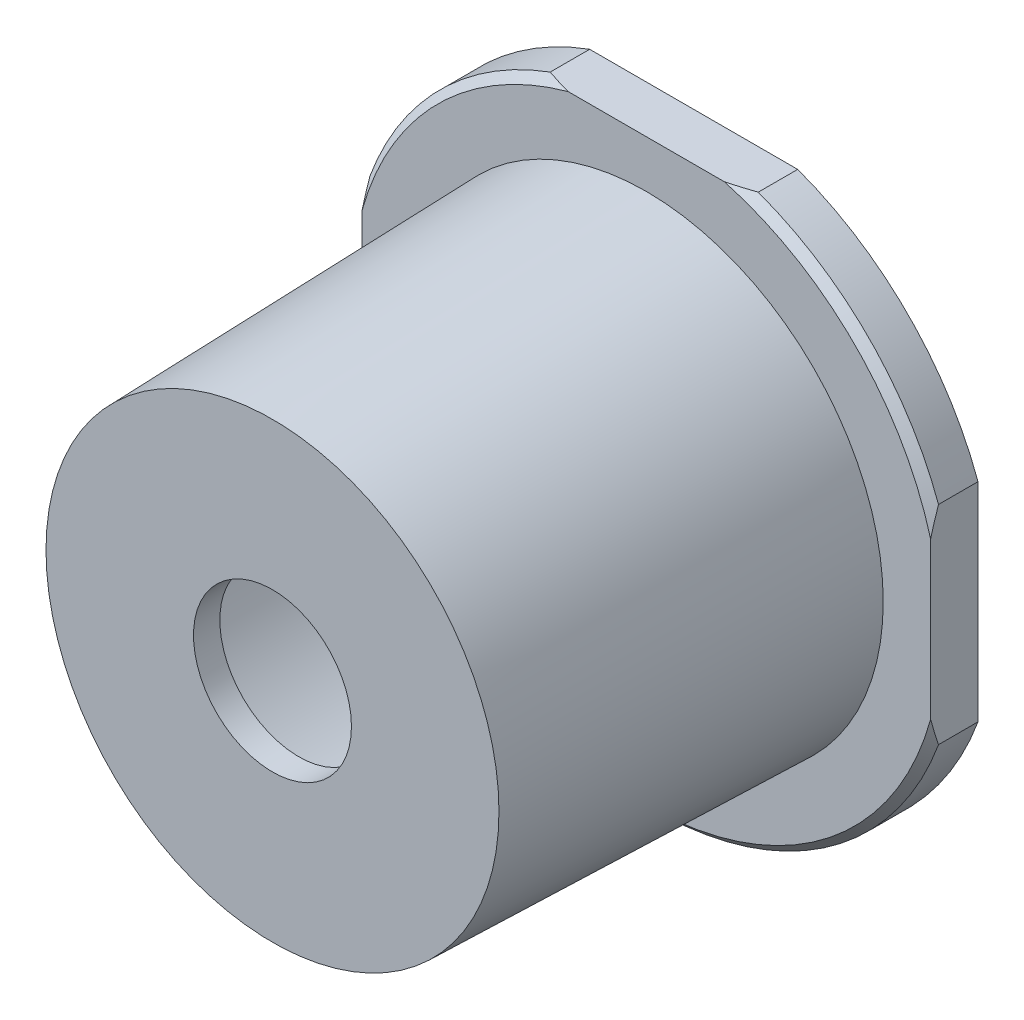
ISO-10303-21;
HEADER;
FILE_DESCRIPTION(('STEP AP214'),'2;1');
FILE_NAME('part.step','',(''),(''),'','','');
FILE_SCHEMA(('AUTOMOTIVE_DESIGN { 1 0 10303 214 1 1 1 1 }'));
ENDSEC;
DATA;
#1=APPLICATION_CONTEXT('core data for automotive mechanical design processes');
#2=APPLICATION_PROTOCOL_DEFINITION('international standard','automotive_design',2000,#1);
#3=PRODUCT_CONTEXT('',#1,'mechanical');
#4=PRODUCT('Part','Part','',(#3));
#5=PRODUCT_RELATED_PRODUCT_CATEGORY('part','',(#4));
#6=PRODUCT_DEFINITION_FORMATION('','',#4);
#7=PRODUCT_DEFINITION_CONTEXT('part definition',#1,'design');
#8=PRODUCT_DEFINITION('design','',#6,#7);
#9=PRODUCT_DEFINITION_SHAPE('','',#8);
#10=(LENGTH_UNIT() NAMED_UNIT(*) SI_UNIT(.MILLI.,.METRE.));
#11=(NAMED_UNIT(*) PLANE_ANGLE_UNIT() SI_UNIT($,.RADIAN.));
#12=(NAMED_UNIT(*) SI_UNIT($,.STERADIAN.) SOLID_ANGLE_UNIT());
#13=UNCERTAINTY_MEASURE_WITH_UNIT(LENGTH_MEASURE(1.E-05),#10,'distance_accuracy_value','');
#14=(GEOMETRIC_REPRESENTATION_CONTEXT(3) GLOBAL_UNCERTAINTY_ASSIGNED_CONTEXT((#13)) GLOBAL_UNIT_ASSIGNED_CONTEXT((#10,
#11,#12)) REPRESENTATION_CONTEXT('',''));
#15=CARTESIAN_POINT('',(0.,0.,0.));
#16=DIRECTION('',(0.,0.,1.));
#17=DIRECTION('',(1.,0.,0.));
#18=AXIS2_PLACEMENT_3D('',#15,#16,#17);
#19=CARTESIAN_POINT('',(0.,0.,18.));
#20=DIRECTION('',(0.,0.,1.));
#21=DIRECTION('',(1.,0.,0.));
#22=AXIS2_PLACEMENT_3D('',#19,#20,#21);
#23=PLANE('',#22);
#24=DIRECTION('',(0.,1.,0.));
#25=VECTOR('',#24,1.);
#26=CARTESIAN_POINT('',(108.,39.5094925302769,18.));
#27=LINE('',#26,#25);
#28=CARTESIAN_POINT('',(108.,-29.6647939483827,18.));
#29=VERTEX_POINT('',#28);
#30=CARTESIAN_POINT('',(108.,29.6647939483828,18.));
#31=VERTEX_POINT('',#30);
#32=EDGE_CURVE('E527',#29,#31,#27,.T.);
#33=ORIENTED_EDGE('',*,*,#32,.T.);
#34=CARTESIAN_POINT('',(0.,0.,18.));
#35=DIRECTION('',(0.,0.,1.));
#36=DIRECTION('',(1.,0.,0.));
#37=AXIS2_PLACEMENT_3D('',#34,#35,#36);
#38=CIRCLE('',#37,112.);
#39=CARTESIAN_POINT('',(29.6647939483828,108.,18.));
#40=VERTEX_POINT('',#39);
#41=EDGE_CURVE('E590',#31,#40,#38,.T.);
#42=ORIENTED_EDGE('',*,*,#41,.T.);
#43=DIRECTION('',(-1.,0.,0.));
#44=VECTOR('',#43,1.);
#45=CARTESIAN_POINT('',(-39.5094925302768,108.,18.));
#46=LINE('',#45,#44);
#47=CARTESIAN_POINT('',(-29.6647939483827,108.,18.));
#48=VERTEX_POINT('',#47);
#49=EDGE_CURVE('E523',#40,#48,#46,.T.);
#50=ORIENTED_EDGE('',*,*,#49,.T.);
#51=CARTESIAN_POINT('',(0.,0.,18.));
#52=DIRECTION('',(0.,0.,1.));
#53=DIRECTION('',(1.,0.,0.));
#54=AXIS2_PLACEMENT_3D('',#51,#52,#53);
#55=CIRCLE('',#54,112.);
#56=CARTESIAN_POINT('',(-108.,29.6647939483827,18.));
#57=VERTEX_POINT('',#56);
#58=EDGE_CURVE('E612',#48,#57,#55,.T.);
#59=ORIENTED_EDGE('',*,*,#58,.T.);
#60=DIRECTION('',(0.,-1.,0.));
#61=VECTOR('',#60,1.);
#62=CARTESIAN_POINT('',(-108.,39.5094925302768,18.));
#63=LINE('',#62,#61);
#64=CARTESIAN_POINT('',(-108.,-29.6647939483827,18.));
#65=VERTEX_POINT('',#64);
#66=EDGE_CURVE('E525',#57,#65,#63,.T.);
#67=ORIENTED_EDGE('',*,*,#66,.T.);
#68=CARTESIAN_POINT('',(0.,0.,18.));
#69=DIRECTION('',(0.,0.,1.));
#70=DIRECTION('',(1.,0.,0.));
#71=AXIS2_PLACEMENT_3D('',#68,#69,#70);
#72=CIRCLE('',#71,112.);
#73=EDGE_CURVE('E542',#65,#29,#72,.T.);
#74=ORIENTED_EDGE('',*,*,#73,.T.);
#75=EDGE_LOOP('',(#33,#42,#50,#59,#67,#74));
#76=FACE_BOUND('',#75,.T.);
#77=CARTESIAN_POINT('',(0.,0.,18.));
#78=DIRECTION('',(0.,0.,1.));
#79=DIRECTION('',(1.,0.,0.));
#80=AXIS2_PLACEMENT_3D('',#77,#78,#79);
#81=CIRCLE('',#80,90.);
#82=CARTESIAN_POINT('',(90.,0.,18.));
#83=VERTEX_POINT('',#82);
#84=EDGE_CURVE('E499',#83,#83,#81,.T.);
#85=ORIENTED_EDGE('',*,*,#84,.F.);
#86=EDGE_LOOP('',(#85));
#87=FACE_BOUND('',#86,.T.);
#88=ADVANCED_FACE('F349',(#76,#87),#23,.T.);
#89=CARTESIAN_POINT('',(0.,0.,18.));
#90=DIRECTION('',(0.,0.,-1.));
#91=DIRECTION('',(-1.,0.,0.));
#92=AXIS2_PLACEMENT_3D('',#89,#90,#91);
#93=CYLINDRICAL_SURFACE('',#92,115.);
#94=DIRECTION('',(0.,0.,-1.));
#95=VECTOR('',#94,1.);
#96=CARTESIAN_POINT('',(39.5094925302768,108.,18.));
#97=LINE('',#96,#95);
#98=CARTESIAN_POINT('',(39.5094925302768,108.,15.));
#99=VERTEX_POINT('',#98);
#100=CARTESIAN_POINT('',(39.5094925302768,108.,0.));
#101=VERTEX_POINT('',#100);
#102=EDGE_CURVE('E540',#99,#101,#97,.T.);
#103=ORIENTED_EDGE('',*,*,#102,.F.);
#104=CARTESIAN_POINT('',(0.,0.,15.));
#105=DIRECTION('',(0.,0.,1.));
#106=DIRECTION('',(1.,0.,0.));
#107=AXIS2_PLACEMENT_3D('',#104,#105,#106);
#108=CIRCLE('',#107,115.);
#109=CARTESIAN_POINT('',(108.,39.5094925302769,15.));
#110=VERTEX_POINT('',#109);
#111=EDGE_CURVE('E358',#99,#110,#108,.F.);
#112=ORIENTED_EDGE('',*,*,#111,.T.);
#113=DIRECTION('',(0.,0.,-1.));
#114=VECTOR('',#113,1.);
#115=CARTESIAN_POINT('',(108.,39.5094925302769,18.));
#116=LINE('',#115,#114);
#117=CARTESIAN_POINT('',(108.,39.5094925302769,0.));
#118=VERTEX_POINT('',#117);
#119=EDGE_CURVE('E530',#110,#118,#116,.T.);
#120=ORIENTED_EDGE('',*,*,#119,.T.);
#121=CARTESIAN_POINT('',(0.,0.,0.));
#122=DIRECTION('',(0.,0.,1.));
#123=DIRECTION('',(1.,0.,0.));
#124=AXIS2_PLACEMENT_3D('',#121,#122,#123);
#125=CIRCLE('',#124,115.);
#126=EDGE_CURVE('E505',#118,#101,#125,.T.);
#127=ORIENTED_EDGE('',*,*,#126,.T.);
#128=EDGE_LOOP('',(#103,#112,#120,#127));
#129=FACE_BOUND('',#128,.T.);
#130=ADVANCED_FACE('F351',(#129),#93,.T.);
#131=CARTESIAN_POINT('',(-39.5094925302768,108.,18.));
#132=DIRECTION('',(0.,-1.,0.));
#133=DIRECTION('',(0.,0.,-1.));
#134=AXIS2_PLACEMENT_3D('',#131,#132,#133);
#135=PLANE('',#134);
#136=ORIENTED_EDGE('',*,*,#49,.F.);
#137=CARTESIAN_POINT('',(29.6647939483828,108.,18.));
#138=CARTESIAN_POINT('',(30.4941711796091,108.,17.7803300114298));
#139=CARTESIAN_POINT('',(31.3214164818125,108.,17.5526537263399));
#140=CARTESIAN_POINT('',(32.9712497524552,108.,17.0819830716863));
#141=CARTESIAN_POINT('',(33.7938391433217,108.,16.838993690178));
#142=CARTESIAN_POINT('',(35.4344929751852,108.,16.3382517901058));
#143=CARTESIAN_POINT('',(36.252557481415,108.,16.0804994849826));
#144=CARTESIAN_POINT('',(37.8843588688999,108.,15.5507584209631));
#145=CARTESIAN_POINT('',(38.6980942612752,108.,15.2787650740456));
#146=CARTESIAN_POINT('',(39.5094925302768,108.,15.));
#147=B_SPLINE_CURVE_WITH_KNOTS('',3,(#137,#138,#139,#140,#141,#142,#143,#144,#145,#146),
.UNSPECIFIED.,.F.,.F.,(4,2,2,2,4),(0.,2.57386992833235,5.14690574048575,7.71990436134134,
10.2937370851217),.UNSPECIFIED.);
#148=EDGE_CURVE('E585',#40,#99,#147,.T.);
#149=ORIENTED_EDGE('',*,*,#148,.T.);
#150=ORIENTED_EDGE('',*,*,#102,.T.);
#151=DIRECTION('',(-1.,0.,0.));
#152=VECTOR('',#151,1.);
#153=CARTESIAN_POINT('',(-39.5094925302768,108.,0.));
#154=LINE('',#153,#152);
#155=CARTESIAN_POINT('',(-39.5094925302768,108.,0.));
#156=VERTEX_POINT('',#155);
#157=EDGE_CURVE('E508',#101,#156,#154,.T.);
#158=ORIENTED_EDGE('',*,*,#157,.T.);
#159=DIRECTION('',(0.,0.,-1.));
#160=VECTOR('',#159,1.);
#161=CARTESIAN_POINT('',(-39.5094925302768,108.,18.));
#162=LINE('',#161,#160);
#163=CARTESIAN_POINT('',(-39.5094925302768,108.,15.));
#164=VERTEX_POINT('',#163);
#165=EDGE_CURVE('E538',#164,#156,#162,.T.);
#166=ORIENTED_EDGE('',*,*,#165,.F.);
#167=CARTESIAN_POINT('',(-39.5094925302768,108.,15.));
#168=CARTESIAN_POINT('',(-38.6980942612752,108.,15.2787650740456));
#169=CARTESIAN_POINT('',(-37.8843588688999,108.,15.5507584209631));
#170=CARTESIAN_POINT('',(-36.2525574814149,108.,16.0804994849826));
#171=CARTESIAN_POINT('',(-35.4344929751851,108.,16.3382517901058));
#172=CARTESIAN_POINT('',(-33.7938391433217,108.,16.838993690178));
#173=CARTESIAN_POINT('',(-32.9712497524552,108.,17.0819830716863));
#174=CARTESIAN_POINT('',(-31.3214164818124,108.,17.5526537263399));
#175=CARTESIAN_POINT('',(-30.4941711796091,108.,17.7803300114298));
#176=CARTESIAN_POINT('',(-29.6647939483827,108.,18.));
#177=B_SPLINE_CURVE_WITH_KNOTS('',3,(#167,#168,#169,#170,#171,#172,#173,#174,#175,#176),
.UNSPECIFIED.,.F.,.F.,(4,2,2,2,4),(0.,2.57383272378042,5.14683134463602,7.71986715678944,
10.2937370851218),.UNSPECIFIED.);
#178=EDGE_CURVE('E599',#164,#48,#177,.T.);
#179=ORIENTED_EDGE('',*,*,#178,.T.);
#180=EDGE_LOOP('',(#136,#149,#150,#158,#166,#179));
#181=FACE_BOUND('',#180,.T.);
#182=ADVANCED_FACE('F592',(#181),#135,.F.);
#183=CARTESIAN_POINT('',(0.,0.,18.));
#184=DIRECTION('',(0.,0.,-1.));
#185=DIRECTION('',(-1.,0.,0.));
#186=AXIS2_PLACEMENT_3D('',#183,#184,#185);
#187=CYLINDRICAL_SURFACE('',#186,115.);
#188=DIRECTION('',(0.,0.,-1.));
#189=VECTOR('',#188,1.);
#190=CARTESIAN_POINT('',(-108.,39.5094925302768,18.));
#191=LINE('',#190,#189);
#192=CARTESIAN_POINT('',(-108.,39.5094925302768,15.));
#193=VERTEX_POINT('',#192);
#194=CARTESIAN_POINT('',(-108.,39.5094925302768,0.));
#195=VERTEX_POINT('',#194);
#196=EDGE_CURVE('E536',#193,#195,#191,.T.);
#197=ORIENTED_EDGE('',*,*,#196,.F.);
#198=CARTESIAN_POINT('',(0.,0.,15.));
#199=DIRECTION('',(0.,0.,1.));
#200=DIRECTION('',(1.,0.,0.));
#201=AXIS2_PLACEMENT_3D('',#198,#199,#200);
#202=CIRCLE('',#201,115.);
#203=EDGE_CURVE('E605',#193,#164,#202,.F.);
#204=ORIENTED_EDGE('',*,*,#203,.T.);
#205=ORIENTED_EDGE('',*,*,#165,.T.);
#206=CARTESIAN_POINT('',(0.,0.,0.));
#207=DIRECTION('',(0.,0.,1.));
#208=DIRECTION('',(1.,0.,0.));
#209=AXIS2_PLACEMENT_3D('',#206,#207,#208);
#210=CIRCLE('',#209,115.);
#211=EDGE_CURVE('E511',#156,#195,#210,.T.);
#212=ORIENTED_EDGE('',*,*,#211,.T.);
#213=EDGE_LOOP('',(#197,#204,#205,#212));
#214=FACE_BOUND('',#213,.T.);
#215=ADVANCED_FACE('F596',(#214),#187,.T.);
#216=CARTESIAN_POINT('',(-108.,39.5094925302768,18.));
#217=DIRECTION('',(1.,0.,0.));
#218=DIRECTION('',(0.,0.,-1.));
#219=AXIS2_PLACEMENT_3D('',#216,#217,#218);
#220=PLANE('',#219);
#221=ORIENTED_EDGE('',*,*,#66,.F.);
#222=CARTESIAN_POINT('',(-108.,29.6647939483827,18.));
#223=CARTESIAN_POINT('',(-108.,30.494171179609,17.7803300114298));
#224=CARTESIAN_POINT('',(-108.,31.3214164818124,17.5526537263399));
#225=CARTESIAN_POINT('',(-108.,32.9712497524551,17.0819830716863));
#226=CARTESIAN_POINT('',(-108.,33.7938391433216,16.838993690178));
#227=CARTESIAN_POINT('',(-108.,35.4344929751851,16.3382517901058));
#228=CARTESIAN_POINT('',(-108.,36.2525574814149,16.0804994849825));
#229=CARTESIAN_POINT('',(-108.,37.8843588688999,15.5507584209631));
#230=CARTESIAN_POINT('',(-108.,38.6980942612752,15.2787650740456));
#231=CARTESIAN_POINT('',(-108.,39.5094925302768,15.));
#232=B_SPLINE_CURVE_WITH_KNOTS('',3,(#222,#223,#224,#225,#226,#227,#228,#229,#230,#231),
.UNSPECIFIED.,.F.,.F.,(4,2,2,2,4),(0.,2.57386992833237,5.1469057404858,7.71990436134141,
10.2937370851218),.UNSPECIFIED.);
#233=EDGE_CURVE('E607',#57,#193,#232,.T.);
#234=ORIENTED_EDGE('',*,*,#233,.T.);
#235=ORIENTED_EDGE('',*,*,#196,.T.);
#236=DIRECTION('',(0.,-1.,0.));
#237=VECTOR('',#236,1.);
#238=CARTESIAN_POINT('',(-108.,39.5094925302768,0.));
#239=LINE('',#238,#237);
#240=CARTESIAN_POINT('',(-108.,-39.5094925302768,0.));
#241=VERTEX_POINT('',#240);
#242=EDGE_CURVE('E514',#195,#241,#239,.T.);
#243=ORIENTED_EDGE('',*,*,#242,.T.);
#244=DIRECTION('',(0.,0.,-1.));
#245=VECTOR('',#244,1.);
#246=CARTESIAN_POINT('',(-108.,-39.5094925302768,18.));
#247=LINE('',#246,#245);
#248=CARTESIAN_POINT('',(-108.,-39.5094925302768,15.));
#249=VERTEX_POINT('',#248);
#250=EDGE_CURVE('E534',#249,#241,#247,.T.);
#251=ORIENTED_EDGE('',*,*,#250,.F.);
#252=CARTESIAN_POINT('',(-108.,-39.5094925302768,15.));
#253=CARTESIAN_POINT('',(-108.,-38.6980942612752,15.2787650740456));
#254=CARTESIAN_POINT('',(-108.,-37.8843588688999,15.5507584209631));
#255=CARTESIAN_POINT('',(-108.,-36.2525574814149,16.0804994849826));
#256=CARTESIAN_POINT('',(-108.,-35.4344929751851,16.3382517901058));
#257=CARTESIAN_POINT('',(-108.,-33.7938391433216,16.838993690178));
#258=CARTESIAN_POINT('',(-108.,-32.9712497524551,17.0819830716863));
#259=CARTESIAN_POINT('',(-108.,-31.3214164818124,17.5526537263399));
#260=CARTESIAN_POINT('',(-108.,-30.494171179609,17.7803300114298));
#261=CARTESIAN_POINT('',(-108.,-29.6647939483827,18.));
#262=B_SPLINE_CURVE_WITH_KNOTS('',3,(#252,#253,#254,#255,#256,#257,#258,#259,#260,#261),
.UNSPECIFIED.,.F.,.F.,(4,2,2,2,4),(0.,2.57383272378042,5.14683134463603,7.71986715678945,
10.2937370851218),.UNSPECIFIED.);
#263=EDGE_CURVE('E618',#249,#65,#262,.T.);
#264=ORIENTED_EDGE('',*,*,#263,.T.);
#265=EDGE_LOOP('',(#221,#234,#235,#243,#251,#264));
#266=FACE_BOUND('',#265,.T.);
#267=ADVANCED_FACE('F613',(#266),#220,.F.);
#268=CARTESIAN_POINT('',(0.,0.,18.));
#269=DIRECTION('',(0.,0.,-1.));
#270=DIRECTION('',(-1.,0.,0.));
#271=AXIS2_PLACEMENT_3D('',#268,#269,#270);
#272=CYLINDRICAL_SURFACE('',#271,115.);
#273=DIRECTION('',(0.,0.,-1.));
#274=VECTOR('',#273,1.);
#275=CARTESIAN_POINT('',(108.,-39.5094925302769,18.));
#276=LINE('',#275,#274);
#277=CARTESIAN_POINT('',(108.,-39.5094925302769,15.));
#278=VERTEX_POINT('',#277);
#279=CARTESIAN_POINT('',(108.,-39.5094925302769,0.));
#280=VERTEX_POINT('',#279);
#281=EDGE_CURVE('E532',#278,#280,#276,.T.);
#282=ORIENTED_EDGE('',*,*,#281,.F.);
#283=CARTESIAN_POINT('',(0.,0.,15.));
#284=DIRECTION('',(0.,0.,1.));
#285=DIRECTION('',(1.,0.,0.));
#286=AXIS2_PLACEMENT_3D('',#283,#284,#285);
#287=CIRCLE('',#286,115.);
#288=EDGE_CURVE('E552',#278,#249,#287,.F.);
#289=ORIENTED_EDGE('',*,*,#288,.T.);
#290=ORIENTED_EDGE('',*,*,#250,.T.);
#291=CARTESIAN_POINT('',(0.,0.,0.));
#292=DIRECTION('',(0.,0.,1.));
#293=DIRECTION('',(1.,0.,0.));
#294=AXIS2_PLACEMENT_3D('',#291,#292,#293);
#295=CIRCLE('',#294,115.);
#296=EDGE_CURVE('E517',#241,#280,#295,.T.);
#297=ORIENTED_EDGE('',*,*,#296,.T.);
#298=EDGE_LOOP('',(#282,#289,#290,#297));
#299=FACE_BOUND('',#298,.T.);
#300=ADVANCED_FACE('F563',(#299),#272,.T.);
#301=CARTESIAN_POINT('',(108.,39.5094925302769,18.));
#302=DIRECTION('',(-1.,0.,0.));
#303=DIRECTION('',(0.,0.,1.));
#304=AXIS2_PLACEMENT_3D('',#301,#302,#303);
#305=PLANE('',#304);
#306=ORIENTED_EDGE('',*,*,#119,.F.);
#307=CARTESIAN_POINT('',(108.,39.5094925302769,15.));
#308=CARTESIAN_POINT('',(108.,38.6980942612753,15.2787650740456));
#309=CARTESIAN_POINT('',(108.,37.8843588689,15.5507584209631));
#310=CARTESIAN_POINT('',(108.,36.252557481415,16.0804994849825));
#311=CARTESIAN_POINT('',(108.,35.4344929751852,16.3382517901058));
#312=CARTESIAN_POINT('',(108.,33.7938391433218,16.838993690178));
#313=CARTESIAN_POINT('',(108.,32.9712497524552,17.0819830716863));
#314=CARTESIAN_POINT('',(108.,31.3214164818125,17.5526537263399));
#315=CARTESIAN_POINT('',(108.,30.4941711796091,17.7803300114298));
#316=CARTESIAN_POINT('',(108.,29.6647939483828,18.));
#317=B_SPLINE_CURVE_WITH_KNOTS('',3,(#307,#308,#309,#310,#311,#312,#313,#314,#315,#316),
.UNSPECIFIED.,.F.,.F.,(4,2,2,2,4),(0.,2.57383272378041,5.14683134463599,7.7198671567894,
10.2937370851217),.UNSPECIFIED.);
#318=EDGE_CURVE('E11',#110,#31,#317,.T.);
#319=ORIENTED_EDGE('',*,*,#318,.T.);
#320=ORIENTED_EDGE('',*,*,#32,.F.);
#321=CARTESIAN_POINT('',(108.,-29.6647939483828,18.));
#322=CARTESIAN_POINT('',(108.,-30.4941711796091,17.7803300114298));
#323=CARTESIAN_POINT('',(108.,-31.3214164818125,17.5526537263399));
#324=CARTESIAN_POINT('',(108.,-32.9712497524552,17.0819830716863));
#325=CARTESIAN_POINT('',(108.,-33.7938391433217,16.838993690178));
#326=CARTESIAN_POINT('',(108.,-35.4344929751852,16.3382517901058));
#327=CARTESIAN_POINT('',(108.,-36.252557481415,16.0804994849826));
#328=CARTESIAN_POINT('',(108.,-37.8843588688999,15.5507584209631));
#329=CARTESIAN_POINT('',(108.,-38.6980942612753,15.2787650740456));
#330=CARTESIAN_POINT('',(108.,-39.5094925302769,15.));
#331=B_SPLINE_CURVE_WITH_KNOTS('',3,(#321,#322,#323,#324,#325,#326,#327,#328,#329,#330),
.UNSPECIFIED.,.F.,.F.,(4,2,2,2,4),(0.,2.57386992833236,5.14690574048577,7.71990436134138,
10.2937370851218),.UNSPECIFIED.);
#332=EDGE_CURVE('E545',#29,#278,#331,.T.);
#333=ORIENTED_EDGE('',*,*,#332,.T.);
#334=ORIENTED_EDGE('',*,*,#281,.T.);
#335=DIRECTION('',(0.,1.,0.));
#336=VECTOR('',#335,1.);
#337=CARTESIAN_POINT('',(108.,39.5094925302769,0.));
#338=LINE('',#337,#336);
#339=EDGE_CURVE('E520',#280,#118,#338,.T.);
#340=ORIENTED_EDGE('',*,*,#339,.T.);
#341=EDGE_LOOP('',(#306,#319,#320,#333,#334,#340));
#342=FACE_BOUND('',#341,.T.);
#343=ADVANCED_FACE('F558',(#342),#305,.F.);
#344=CARTESIAN_POINT('',(0.,0.,0.));
#345=DIRECTION('',(0.,0.,1.));
#346=DIRECTION('',(1.,0.,0.));
#347=AXIS2_PLACEMENT_3D('',#344,#345,#346);
#348=PLANE('',#347);
#349=DIRECTION('',(0.,1.,0.));
#350=VECTOR('',#349,1.);
#351=CARTESIAN_POINT('',(98.,39.5094925302769,0.));
#352=LINE('',#351,#350);
#353=CARTESIAN_POINT('',(98.,-37.6961536499416,0.));
#354=VERTEX_POINT('',#353);
#355=CARTESIAN_POINT('',(98.,37.6961536499416,0.));
#356=VERTEX_POINT('',#355);
#357=EDGE_CURVE('E480',#354,#356,#352,.T.);
#358=ORIENTED_EDGE('',*,*,#357,.T.);
#359=CARTESIAN_POINT('',(0.,0.,0.));
#360=DIRECTION('',(0.,0.,1.));
#361=DIRECTION('',(1.,0.,0.));
#362=AXIS2_PLACEMENT_3D('',#359,#360,#361);
#363=CIRCLE('',#362,105.);
#364=CARTESIAN_POINT('',(37.6961536499415,98.,0.));
#365=VERTEX_POINT('',#364);
#366=EDGE_CURVE('E462',#356,#365,#363,.T.);
#367=ORIENTED_EDGE('',*,*,#366,.T.);
#368=DIRECTION('',(-1.,0.,0.));
#369=VECTOR('',#368,1.);
#370=CARTESIAN_POINT('',(-39.5094925302768,98.,0.));
#371=LINE('',#370,#369);
#372=CARTESIAN_POINT('',(-37.6961536499415,98.,0.));
#373=VERTEX_POINT('',#372);
#374=EDGE_CURVE('E472',#365,#373,#371,.T.);
#375=ORIENTED_EDGE('',*,*,#374,.T.);
#376=CARTESIAN_POINT('',(0.,0.,0.));
#377=DIRECTION('',(0.,0.,1.));
#378=DIRECTION('',(1.,0.,0.));
#379=AXIS2_PLACEMENT_3D('',#376,#377,#378);
#380=CIRCLE('',#379,105.);
#381=CARTESIAN_POINT('',(-98.,37.6961536499415,0.));
#382=VERTEX_POINT('',#381);
#383=EDGE_CURVE('E365',#373,#382,#380,.T.);
#384=ORIENTED_EDGE('',*,*,#383,.T.);
#385=DIRECTION('',(0.,-1.,0.));
#386=VECTOR('',#385,1.);
#387=CARTESIAN_POINT('',(-98.,39.5094925302768,0.));
#388=LINE('',#387,#386);
#389=CARTESIAN_POINT('',(-98.,-37.6961536499415,0.));
#390=VERTEX_POINT('',#389);
#391=EDGE_CURVE('E491',#382,#390,#388,.T.);
#392=ORIENTED_EDGE('',*,*,#391,.T.);
#393=CARTESIAN_POINT('',(0.,0.,0.));
#394=DIRECTION('',(0.,0.,1.));
#395=DIRECTION('',(1.,0.,0.));
#396=AXIS2_PLACEMENT_3D('',#393,#394,#395);
#397=CIRCLE('',#396,105.);
#398=EDGE_CURVE('E489',#390,#354,#397,.T.);
#399=ORIENTED_EDGE('',*,*,#398,.T.);
#400=EDGE_LOOP('',(#358,#367,#375,#384,#392,#399));
#401=FACE_BOUND('',#400,.T.);
#402=ORIENTED_EDGE('',*,*,#126,.F.);
#403=ORIENTED_EDGE('',*,*,#339,.F.);
#404=ORIENTED_EDGE('',*,*,#296,.F.);
#405=ORIENTED_EDGE('',*,*,#242,.F.);
#406=ORIENTED_EDGE('',*,*,#211,.F.);
#407=ORIENTED_EDGE('',*,*,#157,.F.);
#408=EDGE_LOOP('',(#402,#403,#404,#405,#406,#407));
#409=FACE_BOUND('',#408,.T.);
#410=ADVANCED_FACE('F476',(#401,#409),#348,.F.);
#411=CARTESIAN_POINT('',(0.,0.,18.));
#412=DIRECTION('',(0.,0.,-1.));
#413=DIRECTION('',(1.,0.,0.));
#414=AXIS2_PLACEMENT_3D('',#411,#412,#413);
#415=CONICAL_SURFACE('',#414,90.,0.0279252680319093);
#416=CARTESIAN_POINT('',(0.,0.,160.));
#417=DIRECTION('',(0.,0.,1.));
#418=DIRECTION('',(1.,0.,0.));
#419=AXIS2_PLACEMENT_3D('',#416,#417,#418);
#420=CIRCLE('',#419,86.0335808540846);
#421=CARTESIAN_POINT('',(86.0335808540846,0.,160.));
#422=VERTEX_POINT('',#421);
#423=EDGE_CURVE('E502',#422,#422,#420,.T.);
#424=ORIENTED_EDGE('',*,*,#423,.F.);
#425=EDGE_LOOP('',(#424));
#426=FACE_BOUND('',#425,.T.);
#427=ORIENTED_EDGE('',*,*,#84,.T.);
#428=EDGE_LOOP('',(#427));
#429=FACE_BOUND('',#428,.T.);
#430=ADVANCED_FACE('F692',(#426,#429),#415,.T.);
#431=CARTESIAN_POINT('',(0.,0.,160.));
#432=DIRECTION('',(0.,0.,1.));
#433=DIRECTION('',(1.,0.,0.));
#434=AXIS2_PLACEMENT_3D('',#431,#432,#433);
#435=PLANE('',#434);
#436=CARTESIAN_POINT('',(0.,0.,160.));
#437=DIRECTION('',(0.,0.,1.));
#438=DIRECTION('',(1.,0.,0.));
#439=AXIS2_PLACEMENT_3D('',#436,#437,#438);
#440=CIRCLE('',#439,30.);
#441=CARTESIAN_POINT('',(30.,0.,160.));
#442=VERTEX_POINT('',#441);
#443=EDGE_CURVE('E753',#442,#442,#440,.T.);
#444=ORIENTED_EDGE('',*,*,#443,.F.);
#445=EDGE_LOOP('',(#444));
#446=FACE_BOUND('',#445,.T.);
#447=ORIENTED_EDGE('',*,*,#423,.T.);
#448=EDGE_LOOP('',(#447));
#449=FACE_BOUND('',#448,.T.);
#450=ADVANCED_FACE('F683',(#446,#449),#435,.T.);
#451=CARTESIAN_POINT('',(0.,0.,18.));
#452=DIRECTION('',(0.,0.,-1.));
#453=DIRECTION('',(-1.,0.,0.));
#454=AXIS2_PLACEMENT_3D('',#451,#452,#453);
#455=CONICAL_SURFACE('',#454,112.,0.785398163397447);
#456=ORIENTED_EDGE('',*,*,#263,.F.);
#457=ORIENTED_EDGE('',*,*,#288,.F.);
#458=ORIENTED_EDGE('',*,*,#332,.F.);
#459=ORIENTED_EDGE('',*,*,#73,.F.);
#460=EDGE_LOOP('',(#456,#457,#458,#459));
#461=FACE_BOUND('',#460,.T.);
#462=ADVANCED_FACE('F554',(#461),#455,.T.);
#463=CARTESIAN_POINT('',(0.,0.,18.));
#464=DIRECTION('',(0.,0.,-1.));
#465=DIRECTION('',(-1.,0.,0.));
#466=AXIS2_PLACEMENT_3D('',#463,#464,#465);
#467=CONICAL_SURFACE('',#466,112.,0.785398163397443);
#468=ORIENTED_EDGE('',*,*,#178,.F.);
#469=ORIENTED_EDGE('',*,*,#203,.F.);
#470=ORIENTED_EDGE('',*,*,#233,.F.);
#471=ORIENTED_EDGE('',*,*,#58,.F.);
#472=EDGE_LOOP('',(#468,#469,#470,#471));
#473=FACE_BOUND('',#472,.T.);
#474=ADVANCED_FACE('F579',(#473),#467,.T.);
#475=CARTESIAN_POINT('',(0.,0.,18.));
#476=DIRECTION('',(0.,0.,-1.));
#477=DIRECTION('',(-1.,0.,0.));
#478=AXIS2_PLACEMENT_3D('',#475,#476,#477);
#479=CONICAL_SURFACE('',#478,112.,0.785398163397443);
#480=ORIENTED_EDGE('',*,*,#318,.F.);
#481=ORIENTED_EDGE('',*,*,#111,.F.);
#482=ORIENTED_EDGE('',*,*,#148,.F.);
#483=ORIENTED_EDGE('',*,*,#41,.F.);
#484=EDGE_LOOP('',(#480,#481,#482,#483));
#485=FACE_BOUND('',#484,.T.);
#486=ADVANCED_FACE('F574',(#485),#479,.T.);
#487=CARTESIAN_POINT('',(0.,0.,8.));
#488=DIRECTION('',(0.,0.,1.));
#489=DIRECTION('',(1.,0.,0.));
#490=AXIS2_PLACEMENT_3D('',#487,#488,#489);
#491=PLANE('',#490);
#492=CARTESIAN_POINT('',(0.,0.,8.));
#493=DIRECTION('',(0.,0.,1.));
#494=DIRECTION('',(1.,0.,0.));
#495=AXIS2_PLACEMENT_3D('',#492,#493,#494);
#496=CIRCLE('',#495,105.);
#497=CARTESIAN_POINT('',(37.6961536499415,98.,8.));
#498=VERTEX_POINT('',#497);
#499=CARTESIAN_POINT('',(98.,37.6961536499416,8.));
#500=VERTEX_POINT('',#499);
#501=EDGE_CURVE('E464',#498,#500,#496,.F.);
#502=ORIENTED_EDGE('',*,*,#501,.T.);
#503=DIRECTION('',(0.,1.,0.));
#504=VECTOR('',#503,1.);
#505=CARTESIAN_POINT('',(98.,39.5094925302769,8.));
#506=LINE('',#505,#504);
#507=CARTESIAN_POINT('',(98.,-37.6961536499416,8.));
#508=VERTEX_POINT('',#507);
#509=EDGE_CURVE('E763',#508,#500,#506,.T.);
#510=ORIENTED_EDGE('',*,*,#509,.F.);
#511=CARTESIAN_POINT('',(0.,0.,8.));
#512=DIRECTION('',(0.,0.,1.));
#513=DIRECTION('',(1.,0.,0.));
#514=AXIS2_PLACEMENT_3D('',#511,#512,#513);
#515=CIRCLE('',#514,105.);
#516=CARTESIAN_POINT('',(-98.,-37.6961536499415,8.));
#517=VERTEX_POINT('',#516);
#518=EDGE_CURVE('E496',#508,#517,#515,.F.);
#519=ORIENTED_EDGE('',*,*,#518,.T.);
#520=DIRECTION('',(0.,-1.,0.));
#521=VECTOR('',#520,1.);
#522=CARTESIAN_POINT('',(-98.,39.5094925302768,8.));
#523=LINE('',#522,#521);
#524=CARTESIAN_POINT('',(-98.,37.6961536499415,8.));
#525=VERTEX_POINT('',#524);
#526=EDGE_CURVE('E755',#525,#517,#523,.T.);
#527=ORIENTED_EDGE('',*,*,#526,.F.);
#528=CARTESIAN_POINT('',(0.,0.,8.));
#529=DIRECTION('',(0.,0.,1.));
#530=DIRECTION('',(1.,0.,0.));
#531=AXIS2_PLACEMENT_3D('',#528,#529,#530);
#532=CIRCLE('',#531,105.);
#533=CARTESIAN_POINT('',(-37.6961536499415,98.,8.));
#534=VERTEX_POINT('',#533);
#535=EDGE_CURVE('E468',#534,#525,#532,.T.);
#536=ORIENTED_EDGE('',*,*,#535,.F.);
#537=DIRECTION('',(-1.,0.,0.));
#538=VECTOR('',#537,1.);
#539=CARTESIAN_POINT('',(-39.5094925302768,98.,8.));
#540=LINE('',#539,#538);
#541=EDGE_CURVE('E488',#498,#534,#540,.T.);
#542=ORIENTED_EDGE('',*,*,#541,.F.);
#543=EDGE_LOOP('',(#502,#510,#519,#527,#536,#542));
#544=FACE_BOUND('',#543,.T.);
#545=CARTESIAN_POINT('',(0.,0.,8.));
#546=DIRECTION('',(0.,0.,1.));
#547=DIRECTION('',(1.,0.,0.));
#548=AXIS2_PLACEMENT_3D('',#545,#546,#547);
#549=CIRCLE('',#548,80.2754249216737);
#550=CARTESIAN_POINT('',(80.2754249216737,0.,8.));
#551=VERTEX_POINT('',#550);
#552=EDGE_CURVE('E484',#551,#551,#549,.T.);
#553=ORIENTED_EDGE('',*,*,#552,.T.);
#554=EDGE_LOOP('',(#553));
#555=FACE_BOUND('',#554,.T.);
#556=ADVANCED_FACE('F578',(#544,#555),#491,.F.);
#557=CARTESIAN_POINT('',(0.,0.,18.));
#558=DIRECTION('',(0.,0.,-1.));
#559=DIRECTION('',(-1.,0.,0.));
#560=AXIS2_PLACEMENT_3D('',#557,#558,#559);
#561=CYLINDRICAL_SURFACE('',#560,105.);
#562=DIRECTION('',(0.,0.,-1.));
#563=VECTOR('',#562,1.);
#564=CARTESIAN_POINT('',(37.6961536499415,98.,10.8578643762691));
#565=LINE('',#564,#563);
#566=EDGE_CURVE('E457',#498,#365,#565,.T.);
#567=ORIENTED_EDGE('',*,*,#566,.T.);
#568=ORIENTED_EDGE('',*,*,#366,.F.);
#569=DIRECTION('',(0.,0.,-1.));
#570=VECTOR('',#569,1.);
#571=CARTESIAN_POINT('',(98.,37.6961536499416,10.8578643762691));
#572=LINE('',#571,#570);
#573=EDGE_CURVE('E760',#500,#356,#572,.T.);
#574=ORIENTED_EDGE('',*,*,#573,.F.);
#575=ORIENTED_EDGE('',*,*,#501,.F.);
#576=EDGE_LOOP('',(#567,#568,#574,#575));
#577=FACE_BOUND('',#576,.T.);
#578=ADVANCED_FACE('F459',(#577),#561,.F.);
#579=CARTESIAN_POINT('',(-39.5094925302768,98.,18.));
#580=DIRECTION('',(0.,-1.,0.));
#581=DIRECTION('',(0.,0.,-1.));
#582=AXIS2_PLACEMENT_3D('',#579,#580,#581);
#583=PLANE('',#582);
#584=DIRECTION('',(0.,0.,-1.));
#585=VECTOR('',#584,1.);
#586=CARTESIAN_POINT('',(-37.6961536499415,98.,10.8578643762691));
#587=LINE('',#586,#585);
#588=EDGE_CURVE('E469',#534,#373,#587,.T.);
#589=ORIENTED_EDGE('',*,*,#588,.T.);
#590=ORIENTED_EDGE('',*,*,#374,.F.);
#591=ORIENTED_EDGE('',*,*,#566,.F.);
#592=ORIENTED_EDGE('',*,*,#541,.T.);
#593=EDGE_LOOP('',(#589,#590,#591,#592));
#594=FACE_BOUND('',#593,.T.);
#595=ADVANCED_FACE('F473',(#594),#583,.T.);
#596=CARTESIAN_POINT('',(0.,0.,18.));
#597=DIRECTION('',(0.,0.,-1.));
#598=DIRECTION('',(-1.,0.,0.));
#599=AXIS2_PLACEMENT_3D('',#596,#597,#598);
#600=CYLINDRICAL_SURFACE('',#599,105.);
#601=ORIENTED_EDGE('',*,*,#535,.T.);
#602=DIRECTION('',(0.,0.,-1.));
#603=VECTOR('',#602,1.);
#604=CARTESIAN_POINT('',(-98.,37.6961536499415,10.8578643762691));
#605=LINE('',#604,#603);
#606=EDGE_CURVE('E759',#525,#382,#605,.T.);
#607=ORIENTED_EDGE('',*,*,#606,.T.);
#608=ORIENTED_EDGE('',*,*,#383,.F.);
#609=ORIENTED_EDGE('',*,*,#588,.F.);
#610=EDGE_LOOP('',(#601,#607,#608,#609));
#611=FACE_BOUND('',#610,.T.);
#612=ADVANCED_FACE('F727',(#611),#600,.F.);
#613=CARTESIAN_POINT('',(-98.,39.5094925302768,18.));
#614=DIRECTION('',(1.,0.,0.));
#615=DIRECTION('',(0.,0.,-1.));
#616=AXIS2_PLACEMENT_3D('',#613,#614,#615);
#617=PLANE('',#616);
#618=DIRECTION('',(0.,0.,-1.));
#619=VECTOR('',#618,1.);
#620=CARTESIAN_POINT('',(-98.,-37.6961536499415,10.8578643762691));
#621=LINE('',#620,#619);
#622=EDGE_CURVE('E765',#517,#390,#621,.T.);
#623=ORIENTED_EDGE('',*,*,#622,.T.);
#624=ORIENTED_EDGE('',*,*,#391,.F.);
#625=ORIENTED_EDGE('',*,*,#606,.F.);
#626=ORIENTED_EDGE('',*,*,#526,.T.);
#627=EDGE_LOOP('',(#623,#624,#625,#626));
#628=FACE_BOUND('',#627,.T.);
#629=ADVANCED_FACE('F732',(#628),#617,.T.);
#630=CARTESIAN_POINT('',(0.,0.,18.));
#631=DIRECTION('',(0.,0.,-1.));
#632=DIRECTION('',(-1.,0.,0.));
#633=AXIS2_PLACEMENT_3D('',#630,#631,#632);
#634=CYLINDRICAL_SURFACE('',#633,105.);
#635=DIRECTION('',(0.,0.,-1.));
#636=VECTOR('',#635,1.);
#637=CARTESIAN_POINT('',(98.,-37.6961536499416,10.8578643762691));
#638=LINE('',#637,#636);
#639=EDGE_CURVE('E762',#508,#354,#638,.T.);
#640=ORIENTED_EDGE('',*,*,#639,.T.);
#641=ORIENTED_EDGE('',*,*,#398,.F.);
#642=ORIENTED_EDGE('',*,*,#622,.F.);
#643=ORIENTED_EDGE('',*,*,#518,.F.);
#644=EDGE_LOOP('',(#640,#641,#642,#643));
#645=FACE_BOUND('',#644,.T.);
#646=ADVANCED_FACE('F730',(#645),#634,.F.);
#647=CARTESIAN_POINT('',(98.,39.5094925302769,18.));
#648=DIRECTION('',(-1.,0.,0.));
#649=DIRECTION('',(0.,0.,1.));
#650=AXIS2_PLACEMENT_3D('',#647,#648,#649);
#651=PLANE('',#650);
#652=ORIENTED_EDGE('',*,*,#573,.T.);
#653=ORIENTED_EDGE('',*,*,#357,.F.);
#654=ORIENTED_EDGE('',*,*,#639,.F.);
#655=ORIENTED_EDGE('',*,*,#509,.T.);
#656=EDGE_LOOP('',(#652,#653,#654,#655));
#657=FACE_BOUND('',#656,.T.);
#658=ADVANCED_FACE('F728',(#657),#651,.T.);
#659=CARTESIAN_POINT('',(0.,0.,17.7207836127643));
#660=DIRECTION('',(0.,0.,-1.));
#661=DIRECTION('',(1.,0.,0.));
#662=AXIS2_PLACEMENT_3D('',#659,#660,#661);
#663=CONICAL_SURFACE('',#662,80.0038988495965,0.0279252680319093);
#664=CARTESIAN_POINT('',(0.,0.,150.));
#665=DIRECTION('',(0.,0.,1.));
#666=DIRECTION('',(1.,0.,0.));
#667=AXIS2_PLACEMENT_3D('',#664,#665,#666);
#668=CIRCLE('',#667,76.3090057757583);
#669=CARTESIAN_POINT('',(76.3090057757583,0.,150.));
#670=VERTEX_POINT('',#669);
#671=EDGE_CURVE('E481',#670,#670,#668,.T.);
#672=ORIENTED_EDGE('',*,*,#671,.T.);
#673=EDGE_LOOP('',(#672));
#674=FACE_BOUND('',#673,.T.);
#675=ORIENTED_EDGE('',*,*,#552,.F.);
#676=EDGE_LOOP('',(#675));
#677=FACE_BOUND('',#676,.T.);
#678=ADVANCED_FACE('F705',(#674,#677),#663,.F.);
#679=CARTESIAN_POINT('',(0.,0.,150.));
#680=DIRECTION('',(0.,0.,1.));
#681=DIRECTION('',(1.,0.,0.));
#682=AXIS2_PLACEMENT_3D('',#679,#680,#681);
#683=PLANE('',#682);
#684=CARTESIAN_POINT('',(0.,0.,150.));
#685=DIRECTION('',(0.,0.,1.));
#686=DIRECTION('',(1.,0.,0.));
#687=AXIS2_PLACEMENT_3D('',#684,#685,#686);
#688=CIRCLE('',#687,30.);
#689=CARTESIAN_POINT('',(30.,0.,150.));
#690=VERTEX_POINT('',#689);
#691=EDGE_CURVE('E353',#690,#690,#688,.T.);
#692=ORIENTED_EDGE('',*,*,#691,.T.);
#693=EDGE_LOOP('',(#692));
#694=FACE_BOUND('',#693,.T.);
#695=ORIENTED_EDGE('',*,*,#671,.F.);
#696=EDGE_LOOP('',(#695));
#697=FACE_BOUND('',#696,.T.);
#698=ADVANCED_FACE('F581',(#694,#697),#683,.F.);
#699=CARTESIAN_POINT('',(0.,0.,0.));
#700=DIRECTION('',(0.,0.,1.));
#701=DIRECTION('',(1.,0.,0.));
#702=AXIS2_PLACEMENT_3D('',#699,#700,#701);
#703=CYLINDRICAL_SURFACE('',#702,30.);
#704=ORIENTED_EDGE('',*,*,#443,.T.);
#705=EDGE_LOOP('',(#704));
#706=FACE_BOUND('',#705,.T.);
#707=ORIENTED_EDGE('',*,*,#691,.F.);
#708=EDGE_LOOP('',(#707));
#709=FACE_BOUND('',#708,.T.);
#710=ADVANCED_FACE('F712',(#706,#709),#703,.F.);
#711=CLOSED_SHELL('',(#88,#130,#182,#215,#267,#300,#343,#410,#430,#450,#462,#474,#486,#556,#578,
#595,#612,#629,#646,#658,#678,#698,#710));
#712=MANIFOLD_SOLID_BREP('B2',#711);
#713=ADVANCED_BREP_SHAPE_REPRESENTATION('',(#18,#712),#14);
#714=SHAPE_DEFINITION_REPRESENTATION(#9,#713);
ENDSEC;
END-ISO-10303-21;
